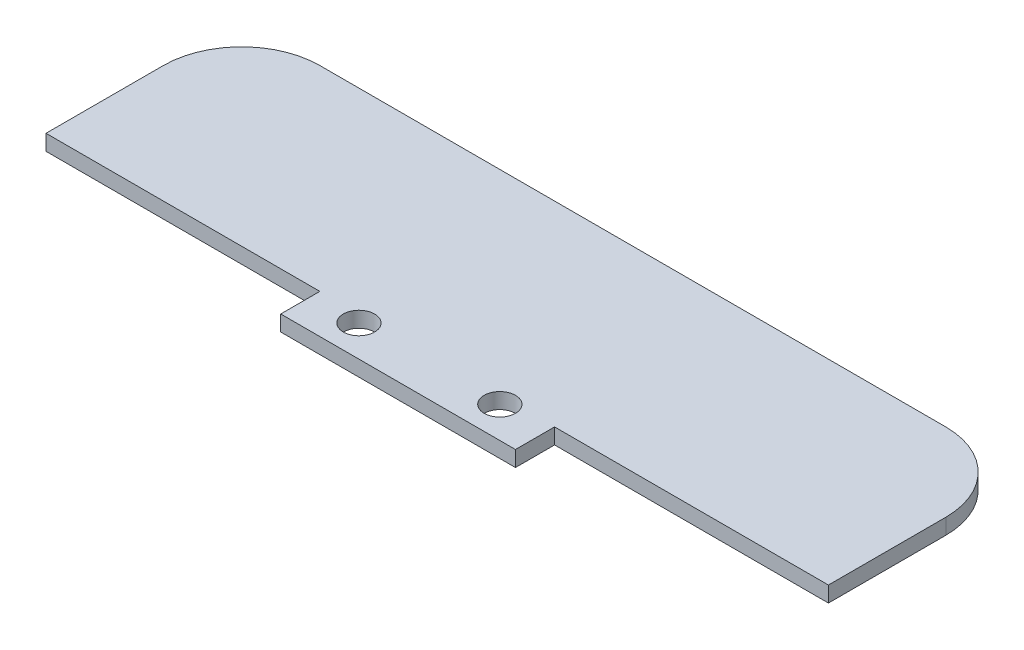
ISO-10303-21;
HEADER;
FILE_DESCRIPTION(('STEP AP214'),'2;1');
FILE_NAME('part.step','',(''),(''),'','','');
FILE_SCHEMA(('AUTOMOTIVE_DESIGN { 1 0 10303 214 1 1 1 1 }'));
ENDSEC;
DATA;
#1=APPLICATION_CONTEXT('core data for automotive mechanical design processes');
#2=APPLICATION_PROTOCOL_DEFINITION('international standard','automotive_design',2000,#1);
#3=PRODUCT_CONTEXT('',#1,'mechanical');
#4=PRODUCT('Part','Part','',(#3));
#5=PRODUCT_RELATED_PRODUCT_CATEGORY('part','',(#4));
#6=PRODUCT_DEFINITION_FORMATION('','',#4);
#7=PRODUCT_DEFINITION_CONTEXT('part definition',#1,'design');
#8=PRODUCT_DEFINITION('design','',#6,#7);
#9=PRODUCT_DEFINITION_SHAPE('','',#8);
#10=(LENGTH_UNIT() NAMED_UNIT(*) SI_UNIT(.MILLI.,.METRE.));
#11=(NAMED_UNIT(*) PLANE_ANGLE_UNIT() SI_UNIT($,.RADIAN.));
#12=(NAMED_UNIT(*) SI_UNIT($,.STERADIAN.) SOLID_ANGLE_UNIT());
#13=UNCERTAINTY_MEASURE_WITH_UNIT(LENGTH_MEASURE(1.E-05),#10,'distance_accuracy_value','');
#14=(GEOMETRIC_REPRESENTATION_CONTEXT(3) GLOBAL_UNCERTAINTY_ASSIGNED_CONTEXT((#13)) GLOBAL_UNIT_ASSIGNED_CONTEXT((#10,
#11,#12)) REPRESENTATION_CONTEXT('',''));
#15=CARTESIAN_POINT('',(0.,0.,0.));
#16=DIRECTION('',(0.,0.,1.));
#17=DIRECTION('',(1.,0.,0.));
#18=AXIS2_PLACEMENT_3D('',#15,#16,#17);
#19=CARTESIAN_POINT('',(0.,2.,0.));
#20=DIRECTION('',(0.,1.,0.));
#21=DIRECTION('',(0.,0.,1.));
#22=AXIS2_PLACEMENT_3D('',#19,#20,#21);
#23=PLANE('',#22);
#24=CARTESIAN_POINT('',(-9.,2.,13.5));
#25=DIRECTION('',(0.,1.,0.));
#26=DIRECTION('',(0.,0.,1.));
#27=AXIS2_PLACEMENT_3D('',#24,#25,#26);
#28=CIRCLE('',#27,2.);
#29=CARTESIAN_POINT('',(-9.,2.,15.5));
#30=VERTEX_POINT('',#29);
#31=EDGE_CURVE('E239',#30,#30,#28,.T.);
#32=ORIENTED_EDGE('',*,*,#31,.F.);
#33=EDGE_LOOP('',(#32));
#34=FACE_BOUND('',#33,.T.);
#35=DIRECTION('',(0.,0.,-1.));
#36=VECTOR('',#35,1.);
#37=CARTESIAN_POINT('',(50.,2.,-12.5));
#38=LINE('',#37,#36);
#39=CARTESIAN_POINT('',(50.,2.,12.5));
#40=VERTEX_POINT('',#39);
#41=CARTESIAN_POINT('',(50.,2.,-2.5));
#42=VERTEX_POINT('',#41);
#43=EDGE_CURVE('E176',#40,#42,#38,.T.);
#44=ORIENTED_EDGE('',*,*,#43,.T.);
#45=CARTESIAN_POINT('',(40.,2.,-2.5));
#46=DIRECTION('',(0.,1.,0.));
#47=DIRECTION('',(0.,0.,1.));
#48=AXIS2_PLACEMENT_3D('',#45,#46,#47);
#49=CIRCLE('',#48,10.);
#50=CARTESIAN_POINT('',(40.,2.,-12.5));
#51=VERTEX_POINT('',#50);
#52=EDGE_CURVE('E52',#42,#51,#49,.T.);
#53=ORIENTED_EDGE('',*,*,#52,.T.);
#54=DIRECTION('',(-1.,0.,0.));
#55=VECTOR('',#54,1.);
#56=CARTESIAN_POINT('',(-50.,2.,-12.5));
#57=LINE('',#56,#55);
#58=CARTESIAN_POINT('',(-40.,2.,-12.5));
#59=VERTEX_POINT('',#58);
#60=EDGE_CURVE('E175',#51,#59,#57,.T.);
#61=ORIENTED_EDGE('',*,*,#60,.T.);
#62=CARTESIAN_POINT('',(-40.,2.,-2.5));
#63=DIRECTION('',(0.,1.,0.));
#64=DIRECTION('',(0.,0.,1.));
#65=AXIS2_PLACEMENT_3D('',#62,#63,#64);
#66=CIRCLE('',#65,10.);
#67=CARTESIAN_POINT('',(-50.,2.,-2.5));
#68=VERTEX_POINT('',#67);
#69=EDGE_CURVE('E59',#59,#68,#66,.T.);
#70=ORIENTED_EDGE('',*,*,#69,.T.);
#71=DIRECTION('',(0.,0.,1.));
#72=VECTOR('',#71,1.);
#73=CARTESIAN_POINT('',(-50.,2.,-12.5));
#74=LINE('',#73,#72);
#75=CARTESIAN_POINT('',(-50.,2.,12.5));
#76=VERTEX_POINT('',#75);
#77=EDGE_CURVE('E139',#68,#76,#74,.T.);
#78=ORIENTED_EDGE('',*,*,#77,.T.);
#79=DIRECTION('',(1.,0.,0.));
#80=VECTOR('',#79,1.);
#81=CARTESIAN_POINT('',(-15.,2.,12.5));
#82=LINE('',#81,#80);
#83=CARTESIAN_POINT('',(-15.,2.,12.5));
#84=VERTEX_POINT('',#83);
#85=EDGE_CURVE('E135',#76,#84,#82,.T.);
#86=ORIENTED_EDGE('',*,*,#85,.T.);
#87=DIRECTION('',(0.,0.,1.));
#88=VECTOR('',#87,1.);
#89=CARTESIAN_POINT('',(-15.,2.,12.5));
#90=LINE('',#89,#88);
#91=CARTESIAN_POINT('',(-15.,2.,17.5));
#92=VERTEX_POINT('',#91);
#93=EDGE_CURVE('E124',#84,#92,#90,.T.);
#94=ORIENTED_EDGE('',*,*,#93,.T.);
#95=DIRECTION('',(1.,0.,0.));
#96=VECTOR('',#95,1.);
#97=CARTESIAN_POINT('',(-15.,2.,17.5));
#98=LINE('',#97,#96);
#99=CARTESIAN_POINT('',(15.,2.,17.5));
#100=VERTEX_POINT('',#99);
#101=EDGE_CURVE('E134',#92,#100,#98,.T.);
#102=ORIENTED_EDGE('',*,*,#101,.T.);
#103=DIRECTION('',(0.,0.,-1.));
#104=VECTOR('',#103,1.);
#105=CARTESIAN_POINT('',(15.,2.,17.5));
#106=LINE('',#105,#104);
#107=CARTESIAN_POINT('',(15.,2.,12.5));
#108=VERTEX_POINT('',#107);
#109=EDGE_CURVE('E226',#100,#108,#106,.T.);
#110=ORIENTED_EDGE('',*,*,#109,.T.);
#111=DIRECTION('',(1.,0.,0.));
#112=VECTOR('',#111,1.);
#113=CARTESIAN_POINT('',(50.,2.,12.5));
#114=LINE('',#113,#112);
#115=EDGE_CURVE('E244',#108,#40,#114,.T.);
#116=ORIENTED_EDGE('',*,*,#115,.T.);
#117=EDGE_LOOP('',(#44,#53,#61,#70,#78,#86,#94,#102,#110,#116));
#118=FACE_BOUND('',#117,.T.);
#119=CARTESIAN_POINT('',(9.,2.,13.5));
#120=DIRECTION('',(0.,1.,0.));
#121=DIRECTION('',(0.,0.,1.));
#122=AXIS2_PLACEMENT_3D('',#119,#120,#121);
#123=CIRCLE('',#122,2.);
#124=CARTESIAN_POINT('',(9.,2.,15.5));
#125=VERTEX_POINT('',#124);
#126=EDGE_CURVE('E255',#125,#125,#123,.T.);
#127=ORIENTED_EDGE('',*,*,#126,.F.);
#128=EDGE_LOOP('',(#127));
#129=FACE_BOUND('',#128,.T.);
#130=ADVANCED_FACE('F43',(#34,#118,#129),#23,.T.);
#131=CARTESIAN_POINT('',(0.,0.,0.));
#132=DIRECTION('',(0.,1.,0.));
#133=DIRECTION('',(0.,0.,1.));
#134=AXIS2_PLACEMENT_3D('',#131,#132,#133);
#135=PLANE('',#134);
#136=DIRECTION('',(-1.,0.,0.));
#137=VECTOR('',#136,1.);
#138=CARTESIAN_POINT('',(-50.,0.,-12.5));
#139=LINE('',#138,#137);
#140=CARTESIAN_POINT('',(40.,0.,-12.5));
#141=VERTEX_POINT('',#140);
#142=CARTESIAN_POINT('',(-40.,0.,-12.5));
#143=VERTEX_POINT('',#142);
#144=EDGE_CURVE('E193',#141,#143,#139,.T.);
#145=ORIENTED_EDGE('',*,*,#144,.F.);
#146=CARTESIAN_POINT('',(40.,0.,-2.5));
#147=DIRECTION('',(0.,1.,0.));
#148=DIRECTION('',(0.,0.,1.));
#149=AXIS2_PLACEMENT_3D('',#146,#147,#148);
#150=CIRCLE('',#149,10.);
#151=CARTESIAN_POINT('',(50.,0.,-2.5));
#152=VERTEX_POINT('',#151);
#153=EDGE_CURVE('E166',#141,#152,#150,.F.);
#154=ORIENTED_EDGE('',*,*,#153,.T.);
#155=DIRECTION('',(0.,0.,-1.));
#156=VECTOR('',#155,1.);
#157=CARTESIAN_POINT('',(50.,0.,-12.5));
#158=LINE('',#157,#156);
#159=CARTESIAN_POINT('',(50.,0.,12.5));
#160=VERTEX_POINT('',#159);
#161=EDGE_CURVE('E192',#160,#152,#158,.T.);
#162=ORIENTED_EDGE('',*,*,#161,.F.);
#163=DIRECTION('',(1.,0.,0.));
#164=VECTOR('',#163,1.);
#165=CARTESIAN_POINT('',(50.,0.,12.5));
#166=LINE('',#165,#164);
#167=CARTESIAN_POINT('',(15.,0.,12.5));
#168=VERTEX_POINT('',#167);
#169=EDGE_CURVE('E199',#168,#160,#166,.T.);
#170=ORIENTED_EDGE('',*,*,#169,.F.);
#171=DIRECTION('',(0.,0.,-1.));
#172=VECTOR('',#171,1.);
#173=CARTESIAN_POINT('',(15.,0.,17.5));
#174=LINE('',#173,#172);
#175=CARTESIAN_POINT('',(15.,0.,17.5));
#176=VERTEX_POINT('',#175);
#177=EDGE_CURVE('E204',#176,#168,#174,.T.);
#178=ORIENTED_EDGE('',*,*,#177,.F.);
#179=DIRECTION('',(1.,0.,0.));
#180=VECTOR('',#179,1.);
#181=CARTESIAN_POINT('',(-15.,0.,17.5));
#182=LINE('',#181,#180);
#183=CARTESIAN_POINT('',(-15.,0.,17.5));
#184=VERTEX_POINT('',#183);
#185=EDGE_CURVE('E229',#184,#176,#182,.T.);
#186=ORIENTED_EDGE('',*,*,#185,.F.);
#187=DIRECTION('',(0.,0.,1.));
#188=VECTOR('',#187,1.);
#189=CARTESIAN_POINT('',(-15.,0.,12.5));
#190=LINE('',#189,#188);
#191=CARTESIAN_POINT('',(-15.,0.,12.5));
#192=VERTEX_POINT('',#191);
#193=EDGE_CURVE('E232',#192,#184,#190,.T.);
#194=ORIENTED_EDGE('',*,*,#193,.F.);
#195=DIRECTION('',(1.,0.,0.));
#196=VECTOR('',#195,1.);
#197=CARTESIAN_POINT('',(-15.,0.,12.5));
#198=LINE('',#197,#196);
#199=CARTESIAN_POINT('',(-50.,0.,12.5));
#200=VERTEX_POINT('',#199);
#201=EDGE_CURVE('E148',#200,#192,#198,.T.);
#202=ORIENTED_EDGE('',*,*,#201,.F.);
#203=DIRECTION('',(0.,0.,1.));
#204=VECTOR('',#203,1.);
#205=CARTESIAN_POINT('',(-50.,0.,-12.5));
#206=LINE('',#205,#204);
#207=CARTESIAN_POINT('',(-50.,0.,-2.5));
#208=VERTEX_POINT('',#207);
#209=EDGE_CURVE('E144',#208,#200,#206,.T.);
#210=ORIENTED_EDGE('',*,*,#209,.F.);
#211=CARTESIAN_POINT('',(-40.,0.,-2.5));
#212=DIRECTION('',(0.,1.,0.));
#213=DIRECTION('',(0.,0.,1.));
#214=AXIS2_PLACEMENT_3D('',#211,#212,#213);
#215=CIRCLE('',#214,10.);
#216=EDGE_CURVE('E163',#208,#143,#215,.F.);
#217=ORIENTED_EDGE('',*,*,#216,.T.);
#218=EDGE_LOOP('',(#145,#154,#162,#170,#178,#186,#194,#202,#210,#217));
#219=FACE_BOUND('',#218,.T.);
#220=CARTESIAN_POINT('',(-9.,0.,13.5));
#221=DIRECTION('',(0.,1.,0.));
#222=DIRECTION('',(0.,0.,1.));
#223=AXIS2_PLACEMENT_3D('',#220,#221,#222);
#224=CIRCLE('',#223,2.);
#225=CARTESIAN_POINT('',(-9.,0.,15.5));
#226=VERTEX_POINT('',#225);
#227=EDGE_CURVE('E251',#226,#226,#224,.T.);
#228=ORIENTED_EDGE('',*,*,#227,.T.);
#229=EDGE_LOOP('',(#228));
#230=FACE_BOUND('',#229,.T.);
#231=CARTESIAN_POINT('',(9.,0.,13.5));
#232=DIRECTION('',(0.,1.,0.));
#233=DIRECTION('',(0.,0.,1.));
#234=AXIS2_PLACEMENT_3D('',#231,#232,#233);
#235=CIRCLE('',#234,2.);
#236=CARTESIAN_POINT('',(9.,0.,15.5));
#237=VERTEX_POINT('',#236);
#238=EDGE_CURVE('E259',#237,#237,#235,.T.);
#239=ORIENTED_EDGE('',*,*,#238,.T.);
#240=EDGE_LOOP('',(#239));
#241=FACE_BOUND('',#240,.T.);
#242=ADVANCED_FACE('F189',(#219,#230,#241),#135,.F.);
#243=CARTESIAN_POINT('',(-15.,2.,12.5));
#244=DIRECTION('',(0.,0.,-1.));
#245=DIRECTION('',(-1.,0.,0.));
#246=AXIS2_PLACEMENT_3D('',#243,#244,#245);
#247=PLANE('',#246);
#248=ORIENTED_EDGE('',*,*,#201,.T.);
#249=DIRECTION('',(0.,-1.,0.));
#250=VECTOR('',#249,1.);
#251=CARTESIAN_POINT('',(-15.,2.,12.5));
#252=LINE('',#251,#250);
#253=EDGE_CURVE('E128',#84,#192,#252,.T.);
#254=ORIENTED_EDGE('',*,*,#253,.F.);
#255=ORIENTED_EDGE('',*,*,#85,.F.);
#256=DIRECTION('',(0.,-1.,0.));
#257=VECTOR('',#256,1.);
#258=CARTESIAN_POINT('',(-50.,2.,12.5));
#259=LINE('',#258,#257);
#260=EDGE_CURVE('E210',#76,#200,#259,.T.);
#261=ORIENTED_EDGE('',*,*,#260,.T.);
#262=EDGE_LOOP('',(#248,#254,#255,#261));
#263=FACE_BOUND('',#262,.T.);
#264=ADVANCED_FACE('F146',(#263),#247,.F.);
#265=CARTESIAN_POINT('',(-15.,2.,12.5));
#266=DIRECTION('',(1.,0.,0.));
#267=DIRECTION('',(0.,0.,-1.));
#268=AXIS2_PLACEMENT_3D('',#265,#266,#267);
#269=PLANE('',#268);
#270=ORIENTED_EDGE('',*,*,#193,.T.);
#271=DIRECTION('',(0.,-1.,0.));
#272=VECTOR('',#271,1.);
#273=CARTESIAN_POINT('',(-15.,2.,17.5));
#274=LINE('',#273,#272);
#275=EDGE_CURVE('E131',#92,#184,#274,.T.);
#276=ORIENTED_EDGE('',*,*,#275,.F.);
#277=ORIENTED_EDGE('',*,*,#93,.F.);
#278=ORIENTED_EDGE('',*,*,#253,.T.);
#279=EDGE_LOOP('',(#270,#276,#277,#278));
#280=FACE_BOUND('',#279,.T.);
#281=ADVANCED_FACE('F126',(#280),#269,.F.);
#282=CARTESIAN_POINT('',(-15.,2.,17.5));
#283=DIRECTION('',(0.,0.,-1.));
#284=DIRECTION('',(-1.,0.,0.));
#285=AXIS2_PLACEMENT_3D('',#282,#283,#284);
#286=PLANE('',#285);
#287=ORIENTED_EDGE('',*,*,#185,.T.);
#288=DIRECTION('',(0.,-1.,0.));
#289=VECTOR('',#288,1.);
#290=CARTESIAN_POINT('',(15.,2.,17.5));
#291=LINE('',#290,#289);
#292=EDGE_CURVE('E156',#100,#176,#291,.T.);
#293=ORIENTED_EDGE('',*,*,#292,.F.);
#294=ORIENTED_EDGE('',*,*,#101,.F.);
#295=ORIENTED_EDGE('',*,*,#275,.T.);
#296=EDGE_LOOP('',(#287,#293,#294,#295));
#297=FACE_BOUND('',#296,.T.);
#298=ADVANCED_FACE('F295',(#297),#286,.F.);
#299=CARTESIAN_POINT('',(15.,2.,17.5));
#300=DIRECTION('',(-1.,0.,0.));
#301=DIRECTION('',(0.,0.,1.));
#302=AXIS2_PLACEMENT_3D('',#299,#300,#301);
#303=PLANE('',#302);
#304=ORIENTED_EDGE('',*,*,#177,.T.);
#305=DIRECTION('',(0.,-1.,0.));
#306=VECTOR('',#305,1.);
#307=CARTESIAN_POINT('',(15.,2.,12.5));
#308=LINE('',#307,#306);
#309=EDGE_CURVE('E215',#108,#168,#308,.T.);
#310=ORIENTED_EDGE('',*,*,#309,.F.);
#311=ORIENTED_EDGE('',*,*,#109,.F.);
#312=ORIENTED_EDGE('',*,*,#292,.T.);
#313=EDGE_LOOP('',(#304,#310,#311,#312));
#314=FACE_BOUND('',#313,.T.);
#315=ADVANCED_FACE('F224',(#314),#303,.F.);
#316=CARTESIAN_POINT('',(50.,2.,12.5));
#317=DIRECTION('',(0.,0.,-1.));
#318=DIRECTION('',(-1.,0.,0.));
#319=AXIS2_PLACEMENT_3D('',#316,#317,#318);
#320=PLANE('',#319);
#321=ORIENTED_EDGE('',*,*,#169,.T.);
#322=DIRECTION('',(0.,-1.,0.));
#323=VECTOR('',#322,1.);
#324=CARTESIAN_POINT('',(50.,2.,12.5));
#325=LINE('',#324,#323);
#326=EDGE_CURVE('E197',#40,#160,#325,.T.);
#327=ORIENTED_EDGE('',*,*,#326,.F.);
#328=ORIENTED_EDGE('',*,*,#115,.F.);
#329=ORIENTED_EDGE('',*,*,#309,.T.);
#330=EDGE_LOOP('',(#321,#327,#328,#329));
#331=FACE_BOUND('',#330,.T.);
#332=ADVANCED_FACE('F289',(#331),#320,.F.);
#333=CARTESIAN_POINT('',(50.,2.,-12.5));
#334=DIRECTION('',(-1.,0.,0.));
#335=DIRECTION('',(0.,0.,1.));
#336=AXIS2_PLACEMENT_3D('',#333,#334,#335);
#337=PLANE('',#336);
#338=ORIENTED_EDGE('',*,*,#161,.T.);
#339=DIRECTION('',(0.,-1.,0.));
#340=VECTOR('',#339,1.);
#341=CARTESIAN_POINT('',(50.,2.,-2.5));
#342=LINE('',#341,#340);
#343=EDGE_CURVE('E67',#152,#42,#342,.F.);
#344=ORIENTED_EDGE('',*,*,#343,.T.);
#345=ORIENTED_EDGE('',*,*,#43,.F.);
#346=ORIENTED_EDGE('',*,*,#326,.T.);
#347=EDGE_LOOP('',(#338,#344,#345,#346));
#348=FACE_BOUND('',#347,.T.);
#349=ADVANCED_FACE('F195',(#348),#337,.F.);
#350=CARTESIAN_POINT('',(-50.,2.,-12.5));
#351=DIRECTION('',(0.,0.,1.));
#352=DIRECTION('',(1.,0.,0.));
#353=AXIS2_PLACEMENT_3D('',#350,#351,#352);
#354=PLANE('',#353);
#355=ORIENTED_EDGE('',*,*,#60,.F.);
#356=DIRECTION('',(0.,-1.,0.));
#357=VECTOR('',#356,1.);
#358=CARTESIAN_POINT('',(40.,2.,-12.5));
#359=LINE('',#358,#357);
#360=EDGE_CURVE('E154',#51,#141,#359,.T.);
#361=ORIENTED_EDGE('',*,*,#360,.T.);
#362=ORIENTED_EDGE('',*,*,#144,.T.);
#363=DIRECTION('',(0.,-1.,0.));
#364=VECTOR('',#363,1.);
#365=CARTESIAN_POINT('',(-40.,2.,-12.5));
#366=LINE('',#365,#364);
#367=EDGE_CURVE('E150',#143,#59,#366,.F.);
#368=ORIENTED_EDGE('',*,*,#367,.T.);
#369=EDGE_LOOP('',(#355,#361,#362,#368));
#370=FACE_BOUND('',#369,.T.);
#371=ADVANCED_FACE('F180',(#370),#354,.F.);
#372=CARTESIAN_POINT('',(-50.,2.,-12.5));
#373=DIRECTION('',(1.,0.,0.));
#374=DIRECTION('',(0.,0.,-1.));
#375=AXIS2_PLACEMENT_3D('',#372,#373,#374);
#376=PLANE('',#375);
#377=ORIENTED_EDGE('',*,*,#77,.F.);
#378=DIRECTION('',(0.,-1.,0.));
#379=VECTOR('',#378,1.);
#380=CARTESIAN_POINT('',(-50.,2.,-2.5));
#381=LINE('',#380,#379);
#382=EDGE_CURVE('E11',#68,#208,#381,.T.);
#383=ORIENTED_EDGE('',*,*,#382,.T.);
#384=ORIENTED_EDGE('',*,*,#209,.T.);
#385=ORIENTED_EDGE('',*,*,#260,.F.);
#386=EDGE_LOOP('',(#377,#383,#384,#385));
#387=FACE_BOUND('',#386,.T.);
#388=ADVANCED_FACE('F281',(#387),#376,.F.);
#389=CARTESIAN_POINT('',(-9.,2.,13.5));
#390=DIRECTION('',(0.,-1.,0.));
#391=DIRECTION('',(0.,0.,-1.));
#392=AXIS2_PLACEMENT_3D('',#389,#390,#391);
#393=CYLINDRICAL_SURFACE('',#392,2.);
#394=ORIENTED_EDGE('',*,*,#31,.T.);
#395=EDGE_LOOP('',(#394));
#396=FACE_BOUND('',#395,.T.);
#397=ORIENTED_EDGE('',*,*,#227,.F.);
#398=EDGE_LOOP('',(#397));
#399=FACE_BOUND('',#398,.T.);
#400=ADVANCED_FACE('F278',(#396,#399),#393,.F.);
#401=CARTESIAN_POINT('',(9.,2.,13.5));
#402=DIRECTION('',(0.,-1.,0.));
#403=DIRECTION('',(0.,0.,-1.));
#404=AXIS2_PLACEMENT_3D('',#401,#402,#403);
#405=CYLINDRICAL_SURFACE('',#404,2.);
#406=ORIENTED_EDGE('',*,*,#126,.T.);
#407=EDGE_LOOP('',(#406));
#408=FACE_BOUND('',#407,.T.);
#409=ORIENTED_EDGE('',*,*,#238,.F.);
#410=EDGE_LOOP('',(#409));
#411=FACE_BOUND('',#410,.T.);
#412=ADVANCED_FACE('F267',(#408,#411),#405,.F.);
#413=CARTESIAN_POINT('',(40.,2.,-2.5));
#414=DIRECTION('',(0.,-1.,0.));
#415=DIRECTION('',(0.,0.,-1.));
#416=AXIS2_PLACEMENT_3D('',#413,#414,#415);
#417=CYLINDRICAL_SURFACE('',#416,10.);
#418=ORIENTED_EDGE('',*,*,#52,.F.);
#419=ORIENTED_EDGE('',*,*,#343,.F.);
#420=ORIENTED_EDGE('',*,*,#153,.F.);
#421=ORIENTED_EDGE('',*,*,#360,.F.);
#422=EDGE_LOOP('',(#418,#419,#420,#421));
#423=FACE_BOUND('',#422,.T.);
#424=ADVANCED_FACE('F186',(#423),#417,.T.);
#425=CARTESIAN_POINT('',(-40.,2.,-2.5));
#426=DIRECTION('',(0.,-1.,0.));
#427=DIRECTION('',(0.,0.,-1.));
#428=AXIS2_PLACEMENT_3D('',#425,#426,#427);
#429=CYLINDRICAL_SURFACE('',#428,10.);
#430=ORIENTED_EDGE('',*,*,#69,.F.);
#431=ORIENTED_EDGE('',*,*,#367,.F.);
#432=ORIENTED_EDGE('',*,*,#216,.F.);
#433=ORIENTED_EDGE('',*,*,#382,.F.);
#434=EDGE_LOOP('',(#430,#431,#432,#433));
#435=FACE_BOUND('',#434,.T.);
#436=ADVANCED_FACE('F45',(#435),#429,.T.);
#437=CLOSED_SHELL('',(#130,#242,#264,#281,#298,#315,#332,#349,#371,#388,#400,#412,#424,#436));
#438=MANIFOLD_SOLID_BREP('B2',#437);
#439=ADVANCED_BREP_SHAPE_REPRESENTATION('',(#18,#438),#14);
#440=SHAPE_DEFINITION_REPRESENTATION(#9,#439);
ENDSEC;
END-ISO-10303-21;
